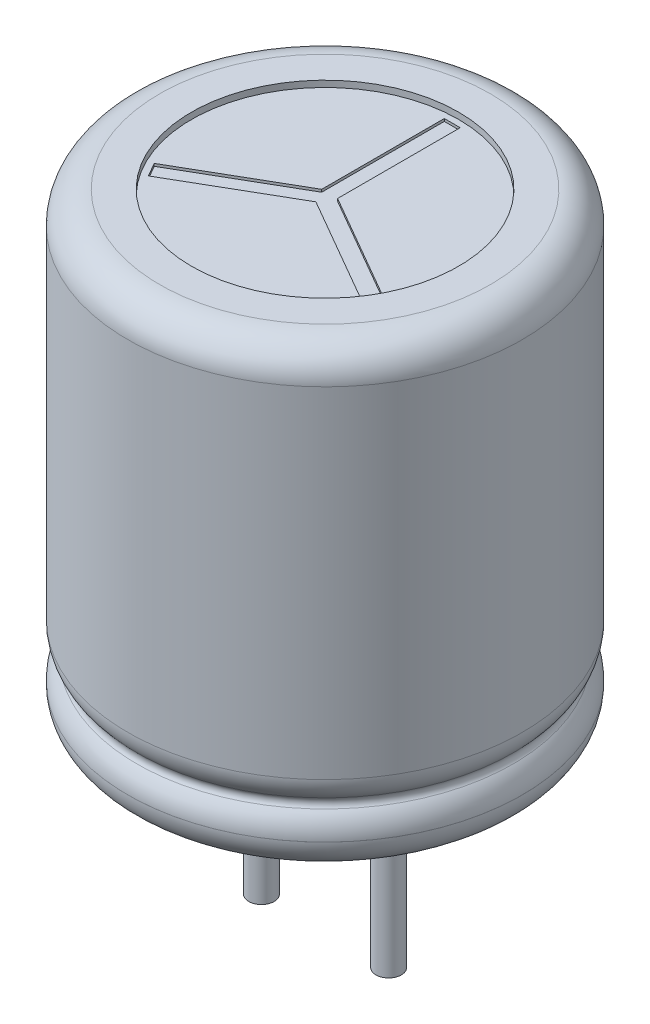
ISO-10303-21;
HEADER;
FILE_DESCRIPTION(('STEP AP214'),'2;1');
FILE_NAME('part.step','',(''),(''),'','','');
FILE_SCHEMA(('AUTOMOTIVE_DESIGN { 1 0 10303 214 1 1 1 1 }'));
ENDSEC;
DATA;
#1=APPLICATION_CONTEXT('core data for automotive mechanical design processes');
#2=APPLICATION_PROTOCOL_DEFINITION('international standard','automotive_design',2000,#1);
#3=PRODUCT_CONTEXT('',#1,'mechanical');
#4=PRODUCT('Part','Part','',(#3));
#5=PRODUCT_RELATED_PRODUCT_CATEGORY('part','',(#4));
#6=PRODUCT_DEFINITION_FORMATION('','',#4);
#7=PRODUCT_DEFINITION_CONTEXT('part definition',#1,'design');
#8=PRODUCT_DEFINITION('design','',#6,#7);
#9=PRODUCT_DEFINITION_SHAPE('','',#8);
#10=(LENGTH_UNIT() NAMED_UNIT(*) SI_UNIT(.MILLI.,.METRE.));
#11=(NAMED_UNIT(*) PLANE_ANGLE_UNIT() SI_UNIT($,.RADIAN.));
#12=(NAMED_UNIT(*) SI_UNIT($,.STERADIAN.) SOLID_ANGLE_UNIT());
#13=UNCERTAINTY_MEASURE_WITH_UNIT(LENGTH_MEASURE(1.E-05),#10,'distance_accuracy_value','');
#14=(GEOMETRIC_REPRESENTATION_CONTEXT(3) GLOBAL_UNCERTAINTY_ASSIGNED_CONTEXT((#13)) GLOBAL_UNIT_ASSIGNED_CONTEXT((#10,
#11,#12)) REPRESENTATION_CONTEXT('',''));
#15=CARTESIAN_POINT('',(0.,0.,0.));
#16=DIRECTION('',(0.,0.,1.));
#17=DIRECTION('',(1.,0.,0.));
#18=AXIS2_PLACEMENT_3D('',#15,#16,#17);
#19=CARTESIAN_POINT('',(1.,-3.,0.));
#20=DIRECTION('',(0.,1.,0.));
#21=DIRECTION('',(0.,0.,1.));
#22=AXIS2_PLACEMENT_3D('',#19,#20,#21);
#23=CYLINDRICAL_SURFACE('',#22,0.2);
#24=CARTESIAN_POINT('',(1.,-3.,0.));
#25=DIRECTION('',(0.,-1.,0.));
#26=DIRECTION('',(0.,0.,1.));
#27=AXIS2_PLACEMENT_3D('',#24,#25,#26);
#28=CIRCLE('',#27,0.2);
#29=CARTESIAN_POINT('',(1.,-3.,0.2));
#30=VERTEX_POINT('',#29);
#31=EDGE_CURVE('E11',#30,#30,#28,.T.);
#32=ORIENTED_EDGE('',*,*,#31,.F.);
#33=EDGE_LOOP('',(#32));
#34=FACE_BOUND('',#33,.T.);
#35=CARTESIAN_POINT('',(1.,0.,0.));
#36=DIRECTION('',(0.,-1.,0.));
#37=DIRECTION('',(0.,0.,1.));
#38=AXIS2_PLACEMENT_3D('',#35,#36,#37);
#39=CIRCLE('',#38,0.2);
#40=CARTESIAN_POINT('',(1.,0.,0.2));
#41=VERTEX_POINT('',#40);
#42=EDGE_CURVE('E42',#41,#41,#39,.T.);
#43=ORIENTED_EDGE('',*,*,#42,.T.);
#44=EDGE_LOOP('',(#43));
#45=FACE_BOUND('',#44,.T.);
#46=ADVANCED_FACE('F39',(#34,#45),#23,.T.);
#47=CARTESIAN_POINT('',(1.,-3.,0.));
#48=DIRECTION('',(0.,1.,0.));
#49=DIRECTION('',(0.,0.,1.));
#50=AXIS2_PLACEMENT_3D('',#47,#48,#49);
#51=PLANE('',#50);
#52=ORIENTED_EDGE('',*,*,#31,.T.);
#53=EDGE_LOOP('',(#52));
#54=FACE_BOUND('',#53,.T.);
#55=ADVANCED_FACE('F54',(#54),#51,.F.);
#56=CARTESIAN_POINT('',(1.,0.,0.));
#57=DIRECTION('',(0.,1.,0.));
#58=DIRECTION('',(0.,0.,1.));
#59=AXIS2_PLACEMENT_3D('',#56,#57,#58);
#60=PLANE('',#59);
#61=ORIENTED_EDGE('',*,*,#42,.F.);
#62=EDGE_LOOP('',(#61));
#63=FACE_BOUND('',#62,.T.);
#64=ADVANCED_FACE('F52',(#63),#60,.T.);
#65=CLOSED_SHELL('',(#46,#55,#64));
#66=MANIFOLD_SOLID_BREP('B2',#65);
#67=CARTESIAN_POINT('',(-1.,-3.,0.));
#68=DIRECTION('',(0.,1.,0.));
#69=DIRECTION('',(0.,0.,1.));
#70=AXIS2_PLACEMENT_3D('',#67,#68,#69);
#71=CYLINDRICAL_SURFACE('',#70,0.2);
#72=CARTESIAN_POINT('',(-1.,-3.,0.));
#73=DIRECTION('',(0.,-1.,0.));
#74=DIRECTION('',(0.,0.,-1.));
#75=AXIS2_PLACEMENT_3D('',#72,#73,#74);
#76=CIRCLE('',#75,0.2);
#77=CARTESIAN_POINT('',(-1.,-3.,-0.2));
#78=VERTEX_POINT('',#77);
#79=EDGE_CURVE('E38',#78,#78,#76,.T.);
#80=ORIENTED_EDGE('',*,*,#79,.F.);
#81=EDGE_LOOP('',(#80));
#82=FACE_BOUND('',#81,.T.);
#83=CARTESIAN_POINT('',(-1.,0.,0.));
#84=DIRECTION('',(0.,-1.,0.));
#85=DIRECTION('',(0.,0.,-1.));
#86=AXIS2_PLACEMENT_3D('',#83,#84,#85);
#87=CIRCLE('',#86,0.2);
#88=CARTESIAN_POINT('',(-1.,0.,-0.2));
#89=VERTEX_POINT('',#88);
#90=EDGE_CURVE('E90',#89,#89,#87,.T.);
#91=ORIENTED_EDGE('',*,*,#90,.T.);
#92=EDGE_LOOP('',(#91));
#93=FACE_BOUND('',#92,.T.);
#94=ADVANCED_FACE('F87',(#82,#93),#71,.T.);
#95=CARTESIAN_POINT('',(-1.,-3.,0.));
#96=DIRECTION('',(0.,-1.,0.));
#97=DIRECTION('',(0.,0.,-1.));
#98=AXIS2_PLACEMENT_3D('',#95,#96,#97);
#99=PLANE('',#98);
#100=ORIENTED_EDGE('',*,*,#79,.T.);
#101=EDGE_LOOP('',(#100));
#102=FACE_BOUND('',#101,.T.);
#103=ADVANCED_FACE('F102',(#102),#99,.T.);
#104=CARTESIAN_POINT('',(-1.,0.,0.));
#105=DIRECTION('',(0.,-1.,0.));
#106=DIRECTION('',(0.,0.,-1.));
#107=AXIS2_PLACEMENT_3D('',#104,#105,#106);
#108=PLANE('',#107);
#109=ORIENTED_EDGE('',*,*,#90,.F.);
#110=EDGE_LOOP('',(#109));
#111=FACE_BOUND('',#110,.T.);
#112=ADVANCED_FACE('F100',(#111),#108,.F.);
#113=CLOSED_SHELL('',(#94,#103,#112));
#114=MANIFOLD_SOLID_BREP('B6',#113);
#115=CARTESIAN_POINT('',(0.,6.6,0.));
#116=DIRECTION('',(0.,-1.,0.));
#117=DIRECTION('',(0.,0.,-1.));
#118=AXIS2_PLACEMENT_3D('',#115,#116,#117);
#119=TOROIDAL_SURFACE('',#118,2.6,0.400000000000001);
#120=CARTESIAN_POINT('',(0.,7.,0.));
#121=DIRECTION('',(0.,-1.,0.));
#122=DIRECTION('',(0.,0.,-1.));
#123=AXIS2_PLACEMENT_3D('',#120,#121,#122);
#124=CIRCLE('',#123,2.6);
#125=CARTESIAN_POINT('',(0.,7.,-2.6));
#126=VERTEX_POINT('',#125);
#127=EDGE_CURVE('E185',#126,#126,#124,.T.);
#128=ORIENTED_EDGE('',*,*,#127,.F.);
#129=EDGE_LOOP('',(#128));
#130=FACE_BOUND('',#129,.T.);
#131=CARTESIAN_POINT('',(0.,6.6,0.));
#132=DIRECTION('',(0.,-1.,0.));
#133=DIRECTION('',(0.,0.,-1.));
#134=AXIS2_PLACEMENT_3D('',#131,#132,#133);
#135=CIRCLE('',#134,3.);
#136=CARTESIAN_POINT('',(0.,6.6,-3.));
#137=VERTEX_POINT('',#136);
#138=EDGE_CURVE('E86',#137,#137,#135,.T.);
#139=ORIENTED_EDGE('',*,*,#138,.T.);
#140=EDGE_LOOP('',(#139));
#141=FACE_BOUND('',#140,.T.);
#142=ADVANCED_FACE('F136',(#130,#141),#119,.F.);
#143=CARTESIAN_POINT('',(0.,0.,0.));
#144=DIRECTION('',(0.,-1.,0.));
#145=DIRECTION('',(0.,0.,-1.));
#146=AXIS2_PLACEMENT_3D('',#143,#144,#145);
#147=CYLINDRICAL_SURFACE('',#146,3.);
#148=ORIENTED_EDGE('',*,*,#138,.F.);
#149=EDGE_LOOP('',(#148));
#150=FACE_BOUND('',#149,.T.);
#151=CARTESIAN_POINT('',(0.,1.25168129847633,0.));
#152=DIRECTION('',(0.,-1.,0.));
#153=DIRECTION('',(0.,0.,-1.));
#154=AXIS2_PLACEMENT_3D('',#151,#152,#153);
#155=CIRCLE('',#154,3.);
#156=CARTESIAN_POINT('',(0.,1.25168129847633,-3.));
#157=VERTEX_POINT('',#156);
#158=EDGE_CURVE('E142',#157,#157,#155,.T.);
#159=ORIENTED_EDGE('',*,*,#158,.T.);
#160=EDGE_LOOP('',(#159));
#161=FACE_BOUND('',#160,.T.);
#162=ADVANCED_FACE('F192',(#150,#161),#147,.F.);
#163=CARTESIAN_POINT('',(0.,0.683149058938359,0.));
#164=DIRECTION('',(0.,1.,0.));
#165=DIRECTION('',(0.,0.,1.));
#166=AXIS2_PLACEMENT_3D('',#163,#164,#165);
#167=CONICAL_SURFACE('',#166,2.88253603384759,0.203742365446496);
#168=ORIENTED_EDGE('',*,*,#158,.F.);
#169=EDGE_LOOP('',(#168));
#170=FACE_BOUND('',#169,.T.);
#171=CARTESIAN_POINT('',(0.,0.683149058938359,0.));
#172=DIRECTION('',(0.,-1.,0.));
#173=DIRECTION('',(0.,0.,-1.));
#174=AXIS2_PLACEMENT_3D('',#171,#172,#173);
#175=CIRCLE('',#174,2.88253603384759);
#176=CARTESIAN_POINT('',(0.,0.683149058938359,-2.88253603384759));
#177=VERTEX_POINT('',#176);
#178=EDGE_CURVE('E146',#177,#177,#175,.T.);
#179=ORIENTED_EDGE('',*,*,#178,.T.);
#180=EDGE_LOOP('',(#179));
#181=FACE_BOUND('',#180,.T.);
#182=ADVANCED_FACE('F196',(#170,#181),#167,.F.);
#183=CARTESIAN_POINT('',(0.,0.400000000000001,0.));
#184=DIRECTION('',(0.,-1.,0.));
#185=DIRECTION('',(0.,0.,-1.));
#186=AXIS2_PLACEMENT_3D('',#183,#184,#185);
#187=TOROIDAL_SURFACE('',#186,2.6,0.400000000000001);
#188=ORIENTED_EDGE('',*,*,#178,.F.);
#189=EDGE_LOOP('',(#188));
#190=FACE_BOUND('',#189,.T.);
#191=CARTESIAN_POINT('',(0.,0.,0.));
#192=DIRECTION('',(0.,-1.,0.));
#193=DIRECTION('',(0.,0.,-1.));
#194=AXIS2_PLACEMENT_3D('',#191,#192,#193);
#195=CIRCLE('',#194,2.6);
#196=CARTESIAN_POINT('',(0.,0.,-2.6));
#197=VERTEX_POINT('',#196);
#198=EDGE_CURVE('E150',#197,#197,#195,.T.);
#199=ORIENTED_EDGE('',*,*,#198,.T.);
#200=EDGE_LOOP('',(#199));
#201=FACE_BOUND('',#200,.T.);
#202=ADVANCED_FACE('F201',(#190,#201),#187,.F.);
#203=CARTESIAN_POINT('',(0.,0.,0.));
#204=DIRECTION('',(0.,-1.,0.));
#205=DIRECTION('',(0.,0.,-1.));
#206=AXIS2_PLACEMENT_3D('',#203,#204,#205);
#207=CYLINDRICAL_SURFACE('',#206,2.6);
#208=ORIENTED_EDGE('',*,*,#198,.F.);
#209=EDGE_LOOP('',(#208));
#210=FACE_BOUND('',#209,.T.);
#211=CARTESIAN_POINT('',(0.,-0.1,0.));
#212=DIRECTION('',(0.,-1.,0.));
#213=DIRECTION('',(0.,0.,-1.));
#214=AXIS2_PLACEMENT_3D('',#211,#212,#213);
#215=CIRCLE('',#214,2.6);
#216=CARTESIAN_POINT('',(0.,-0.1,-2.6));
#217=VERTEX_POINT('',#216);
#218=EDGE_CURVE('E155',#217,#217,#215,.T.);
#219=ORIENTED_EDGE('',*,*,#218,.T.);
#220=EDGE_LOOP('',(#219));
#221=FACE_BOUND('',#220,.T.);
#222=ADVANCED_FACE('F207',(#210,#221),#207,.F.);
#223=CARTESIAN_POINT('',(0.,0.400000000000001,0.));
#224=DIRECTION('',(0.,-1.,0.));
#225=DIRECTION('',(0.,0.,-1.));
#226=AXIS2_PLACEMENT_3D('',#223,#224,#225);
#227=TOROIDAL_SURFACE('',#226,2.6,0.500000000000001);
#228=ORIENTED_EDGE('',*,*,#218,.F.);
#229=EDGE_LOOP('',(#228));
#230=FACE_BOUND('',#229,.T.);
#231=CARTESIAN_POINT('',(0.,0.400000000000001,0.));
#232=DIRECTION('',(0.,-1.,0.));
#233=DIRECTION('',(0.,0.,-1.));
#234=AXIS2_PLACEMENT_3D('',#231,#232,#233);
#235=CIRCLE('',#234,3.1);
#236=CARTESIAN_POINT('',(0.,0.400000000000001,-3.1));
#237=VERTEX_POINT('',#236);
#238=EDGE_CURVE('E158',#237,#237,#235,.T.);
#239=ORIENTED_EDGE('',*,*,#238,.T.);
#240=EDGE_LOOP('',(#239));
#241=FACE_BOUND('',#240,.T.);
#242=ADVANCED_FACE('F211',(#230,#241),#227,.T.);
#243=CARTESIAN_POINT('',(0.,0.,0.));
#244=DIRECTION('',(0.,-1.,0.));
#245=DIRECTION('',(0.,0.,-1.));
#246=AXIS2_PLACEMENT_3D('',#243,#244,#245);
#247=CYLINDRICAL_SURFACE('',#246,3.1);
#248=ORIENTED_EDGE('',*,*,#238,.F.);
#249=EDGE_LOOP('',(#248));
#250=FACE_BOUND('',#249,.T.);
#251=CARTESIAN_POINT('',(0.,0.400804335279112,0.));
#252=DIRECTION('',(0.,-1.,0.));
#253=DIRECTION('',(0.,0.,-1.));
#254=AXIS2_PLACEMENT_3D('',#251,#252,#253);
#255=CIRCLE('',#254,3.1);
#256=CARTESIAN_POINT('',(0.,0.400804335279112,-3.1));
#257=VERTEX_POINT('',#256);
#258=EDGE_CURVE('E161',#257,#257,#255,.T.);
#259=ORIENTED_EDGE('',*,*,#258,.T.);
#260=EDGE_LOOP('',(#259));
#261=FACE_BOUND('',#260,.T.);
#262=ADVANCED_FACE('F215',(#250,#261),#247,.T.);
#263=CARTESIAN_POINT('',(0.,0.400804335279112,0.));
#264=DIRECTION('',(0.,-1.,0.));
#265=DIRECTION('',(0.,0.,-1.));
#266=AXIS2_PLACEMENT_3D('',#263,#264,#265);
#267=TOROIDAL_SURFACE('',#266,2.6,0.5);
#268=ORIENTED_EDGE('',*,*,#258,.F.);
#269=EDGE_LOOP('',(#268));
#270=FACE_BOUND('',#269,.T.);
#271=CARTESIAN_POINT('',(0.,0.750713489270416,0.));
#272=DIRECTION('',(0.,-1.,0.));
#273=DIRECTION('',(0.,0.,-1.));
#274=AXIS2_PLACEMENT_3D('',#271,#272,#273);
#275=CIRCLE('',#274,2.95716044567266);
#276=CARTESIAN_POINT('',(0.,0.750713489270416,-2.95716044567266));
#277=VERTEX_POINT('',#276);
#278=EDGE_CURVE('E164',#277,#277,#275,.T.);
#279=ORIENTED_EDGE('',*,*,#278,.T.);
#280=EDGE_LOOP('',(#279));
#281=FACE_BOUND('',#280,.T.);
#282=ADVANCED_FACE('F219',(#270,#281),#267,.T.);
#283=CARTESIAN_POINT('',(0.,0.826242816877722,0.));
#284=DIRECTION('',(0.,-1.,0.));
#285=DIRECTION('',(0.,0.,-1.));
#286=AXIS2_PLACEMENT_3D('',#283,#284,#285);
#287=TOROIDAL_SURFACE('',#286,3.03425499436301,0.107927052987564);
#288=ORIENTED_EDGE('',*,*,#278,.F.);
#289=EDGE_LOOP('',(#288));
#290=FACE_BOUND('',#289,.T.);
#291=CARTESIAN_POINT('',(0.,0.901772144485029,0.));
#292=DIRECTION('',(0.,-1.,0.));
#293=DIRECTION('',(0.,0.,-1.));
#294=AXIS2_PLACEMENT_3D('',#291,#292,#293);
#295=CIRCLE('',#294,2.95716044567266);
#296=CARTESIAN_POINT('',(0.,0.901772144485029,-2.95716044567266));
#297=VERTEX_POINT('',#296);
#298=EDGE_CURVE('E167',#297,#297,#295,.T.);
#299=ORIENTED_EDGE('',*,*,#298,.T.);
#300=EDGE_LOOP('',(#299));
#301=FACE_BOUND('',#300,.T.);
#302=ADVANCED_FACE('F223',(#290,#301),#287,.F.);
#303=CARTESIAN_POINT('',(0.,1.25168129847633,0.));
#304=DIRECTION('',(0.,-1.,0.));
#305=DIRECTION('',(0.,0.,-1.));
#306=AXIS2_PLACEMENT_3D('',#303,#304,#305);
#307=TOROIDAL_SURFACE('',#306,2.6,0.5);
#308=ORIENTED_EDGE('',*,*,#298,.F.);
#309=EDGE_LOOP('',(#308));
#310=FACE_BOUND('',#309,.T.);
#311=CARTESIAN_POINT('',(0.,1.25168129847633,0.));
#312=DIRECTION('',(0.,-1.,0.));
#313=DIRECTION('',(0.,0.,-1.));
#314=AXIS2_PLACEMENT_3D('',#311,#312,#313);
#315=CIRCLE('',#314,3.1);
#316=CARTESIAN_POINT('',(0.,1.25168129847633,-3.1));
#317=VERTEX_POINT('',#316);
#318=EDGE_CURVE('E170',#317,#317,#315,.T.);
#319=ORIENTED_EDGE('',*,*,#318,.T.);
#320=EDGE_LOOP('',(#319));
#321=FACE_BOUND('',#320,.T.);
#322=ADVANCED_FACE('F227',(#310,#321),#307,.T.);
#323=CARTESIAN_POINT('',(0.,0.,0.));
#324=DIRECTION('',(0.,-1.,0.));
#325=DIRECTION('',(0.,0.,-1.));
#326=AXIS2_PLACEMENT_3D('',#323,#324,#325);
#327=CYLINDRICAL_SURFACE('',#326,3.1);
#328=ORIENTED_EDGE('',*,*,#318,.F.);
#329=EDGE_LOOP('',(#328));
#330=FACE_BOUND('',#329,.T.);
#331=CARTESIAN_POINT('',(0.,6.6,0.));
#332=DIRECTION('',(0.,-1.,0.));
#333=DIRECTION('',(0.,0.,-1.));
#334=AXIS2_PLACEMENT_3D('',#331,#332,#333);
#335=CIRCLE('',#334,3.1);
#336=CARTESIAN_POINT('',(0.,6.6,-3.1));
#337=VERTEX_POINT('',#336);
#338=EDGE_CURVE('E173',#337,#337,#335,.T.);
#339=ORIENTED_EDGE('',*,*,#338,.T.);
#340=EDGE_LOOP('',(#339));
#341=FACE_BOUND('',#340,.T.);
#342=ADVANCED_FACE('F231',(#330,#341),#327,.T.);
#343=CARTESIAN_POINT('',(0.,6.6,0.));
#344=DIRECTION('',(0.,-1.,0.));
#345=DIRECTION('',(0.,0.,-1.));
#346=AXIS2_PLACEMENT_3D('',#343,#344,#345);
#347=TOROIDAL_SURFACE('',#346,2.6,0.500000000000001);
#348=ORIENTED_EDGE('',*,*,#338,.F.);
#349=EDGE_LOOP('',(#348));
#350=FACE_BOUND('',#349,.T.);
#351=CARTESIAN_POINT('',(0.,7.1,0.));
#352=DIRECTION('',(0.,-1.,0.));
#353=DIRECTION('',(0.,0.,-1.));
#354=AXIS2_PLACEMENT_3D('',#351,#352,#353);
#355=CIRCLE('',#354,2.6);
#356=CARTESIAN_POINT('',(0.,7.1,-2.6));
#357=VERTEX_POINT('',#356);
#358=EDGE_CURVE('E176',#357,#357,#355,.T.);
#359=ORIENTED_EDGE('',*,*,#358,.T.);
#360=EDGE_LOOP('',(#359));
#361=FACE_BOUND('',#360,.T.);
#362=ADVANCED_FACE('F235',(#350,#361),#347,.T.);
#363=CARTESIAN_POINT('',(-2.6,7.1,0.));
#364=DIRECTION('',(0.,-1.,0.));
#365=DIRECTION('',(0.,0.,-1.));
#366=AXIS2_PLACEMENT_3D('',#363,#364,#365);
#367=PLANE('',#366);
#368=ORIENTED_EDGE('',*,*,#358,.F.);
#369=EDGE_LOOP('',(#368));
#370=FACE_BOUND('',#369,.T.);
#371=CARTESIAN_POINT('',(0.,7.1,0.));
#372=DIRECTION('',(0.,-1.,0.));
#373=DIRECTION('',(0.,0.,-1.));
#374=AXIS2_PLACEMENT_3D('',#371,#372,#373);
#375=CIRCLE('',#374,2.1);
#376=CARTESIAN_POINT('',(0.,7.1,-2.1));
#377=VERTEX_POINT('',#376);
#378=EDGE_CURVE('E179',#377,#377,#375,.T.);
#379=ORIENTED_EDGE('',*,*,#378,.T.);
#380=EDGE_LOOP('',(#379));
#381=FACE_BOUND('',#380,.T.);
#382=ADVANCED_FACE('F239',(#370,#381),#367,.F.);
#383=CARTESIAN_POINT('',(0.,0.,0.));
#384=DIRECTION('',(0.,-1.,0.));
#385=DIRECTION('',(0.,0.,-1.));
#386=AXIS2_PLACEMENT_3D('',#383,#384,#385);
#387=CYLINDRICAL_SURFACE('',#386,2.1);
#388=ORIENTED_EDGE('',*,*,#378,.F.);
#389=EDGE_LOOP('',(#388));
#390=FACE_BOUND('',#389,.T.);
#391=CARTESIAN_POINT('',(0.,7.,0.));
#392=DIRECTION('',(0.,-1.,0.));
#393=DIRECTION('',(0.,0.,-1.));
#394=AXIS2_PLACEMENT_3D('',#391,#392,#393);
#395=CIRCLE('',#394,2.1);
#396=CARTESIAN_POINT('',(0.,7.,-2.1));
#397=VERTEX_POINT('',#396);
#398=EDGE_CURVE('E182',#397,#397,#395,.T.);
#399=ORIENTED_EDGE('',*,*,#398,.T.);
#400=EDGE_LOOP('',(#399));
#401=FACE_BOUND('',#400,.T.);
#402=ADVANCED_FACE('F243',(#390,#401),#387,.F.);
#403=CARTESIAN_POINT('',(-2.1,7.,0.));
#404=DIRECTION('',(0.,1.,0.));
#405=DIRECTION('',(0.,0.,1.));
#406=AXIS2_PLACEMENT_3D('',#403,#404,#405);
#407=PLANE('',#406);
#408=ORIENTED_EDGE('',*,*,#398,.F.);
#409=EDGE_LOOP('',(#408));
#410=FACE_BOUND('',#409,.T.);
#411=ORIENTED_EDGE('',*,*,#127,.T.);
#412=EDGE_LOOP('',(#411));
#413=FACE_BOUND('',#412,.T.);
#414=ADVANCED_FACE('F189',(#410,#413),#407,.F.);
#415=CLOSED_SHELL('',(#142,#162,#182,#202,#222,#242,#262,#282,#302,#322,#342,#362,#382,#402,#414));
#416=MANIFOLD_SOLID_BREP('B33',#415);
#417=CARTESIAN_POINT('',(0.,0.,0.));
#418=DIRECTION('',(0.,-1.,0.));
#419=DIRECTION('',(0.,0.,-1.));
#420=AXIS2_PLACEMENT_3D('',#417,#418,#419);
#421=CYLINDRICAL_SURFACE('',#420,3.);
#422=CARTESIAN_POINT('',(0.,0.400000000000001,0.));
#423=DIRECTION('',(0.,-1.,0.));
#424=DIRECTION('',(0.,0.,-1.));
#425=AXIS2_PLACEMENT_3D('',#422,#423,#424);
#426=CIRCLE('',#425,3.);
#427=CARTESIAN_POINT('',(0.,0.400000000000001,-3.));
#428=VERTEX_POINT('',#427);
#429=EDGE_CURVE('E508',#428,#428,#426,.T.);
#430=ORIENTED_EDGE('',*,*,#429,.F.);
#431=EDGE_LOOP('',(#430));
#432=FACE_BOUND('',#431,.T.);
#433=CARTESIAN_POINT('',(0.,0.606567662780015,0.));
#434=DIRECTION('',(0.,1.,0.));
#435=DIRECTION('',(0.,0.,1.));
#436=AXIS2_PLACEMENT_3D('',#433,#434,#435);
#437=CIRCLE('',#436,3.);
#438=CARTESIAN_POINT('',(0.,0.606567662780015,3.));
#439=VERTEX_POINT('',#438);
#440=EDGE_CURVE('E366',#439,#439,#437,.T.);
#441=ORIENTED_EDGE('',*,*,#440,.F.);
#442=EDGE_LOOP('',(#441));
#443=FACE_BOUND('',#442,.T.);
#444=ADVANCED_FACE('F362',(#432,#443),#421,.T.);
#445=CARTESIAN_POINT('',(0.,0.400000000000001,0.));
#446=DIRECTION('',(0.,-1.,0.));
#447=DIRECTION('',(0.,0.,-1.));
#448=AXIS2_PLACEMENT_3D('',#445,#446,#447);
#449=TOROIDAL_SURFACE('',#448,2.6,0.400000000000001);
#450=CARTESIAN_POINT('',(0.,0.,0.));
#451=DIRECTION('',(0.,-1.,0.));
#452=DIRECTION('',(0.,0.,-1.));
#453=AXIS2_PLACEMENT_3D('',#450,#451,#452);
#454=CIRCLE('',#453,2.6);
#455=CARTESIAN_POINT('',(0.,0.,-2.6));
#456=VERTEX_POINT('',#455);
#457=EDGE_CURVE('E505',#456,#456,#454,.T.);
#458=ORIENTED_EDGE('',*,*,#457,.F.);
#459=EDGE_LOOP('',(#458));
#460=FACE_BOUND('',#459,.T.);
#461=ORIENTED_EDGE('',*,*,#429,.T.);
#462=EDGE_LOOP('',(#461));
#463=FACE_BOUND('',#462,.T.);
#464=ADVANCED_FACE('F521',(#460,#463),#449,.T.);
#465=CARTESIAN_POINT('',(-2.6,0.,0.));
#466=DIRECTION('',(0.,1.,0.));
#467=DIRECTION('',(0.,0.,1.));
#468=AXIS2_PLACEMENT_3D('',#465,#466,#467);
#469=PLANE('',#468);
#470=ORIENTED_EDGE('',*,*,#457,.T.);
#471=EDGE_LOOP('',(#470));
#472=FACE_BOUND('',#471,.T.);
#473=ADVANCED_FACE('F528',(#472),#469,.F.);
#474=CARTESIAN_POINT('',(0.,0.906567662780018,0.));
#475=DIRECTION('',(0.,-1.,0.));
#476=DIRECTION('',(0.,0.,-1.));
#477=AXIS2_PLACEMENT_3D('',#474,#475,#476);
#478=TOROIDAL_SURFACE('',#477,3.4,0.5);
#479=CARTESIAN_POINT('',(0.,1.20656766278002,0.));
#480=DIRECTION('',(0.,-1.,0.));
#481=DIRECTION('',(0.,0.,-1.));
#482=AXIS2_PLACEMENT_3D('',#479,#480,#481);
#483=CIRCLE('',#482,3.);
#484=CARTESIAN_POINT('',(0.,1.20656766278002,-3.));
#485=VERTEX_POINT('',#484);
#486=EDGE_CURVE('E493',#485,#485,#483,.T.);
#487=ORIENTED_EDGE('',*,*,#486,.T.);
#488=EDGE_LOOP('',(#487));
#489=FACE_BOUND('',#488,.T.);
#490=ORIENTED_EDGE('',*,*,#440,.T.);
#491=EDGE_LOOP('',(#490));
#492=FACE_BOUND('',#491,.T.);
#493=ADVANCED_FACE('F518',(#489,#492),#478,.F.);
#494=CARTESIAN_POINT('',(0.,7.,0.));
#495=DIRECTION('',(0.,-1.,0.));
#496=DIRECTION('',(0.,0.,-1.));
#497=AXIS2_PLACEMENT_3D('',#494,#495,#496);
#498=PLANE('',#497);
#499=DIRECTION('',(0.500000000000001,0.,0.866025403784438));
#500=VECTOR('',#499,1.);
#501=CARTESIAN_POINT('',(-1.79455080756888,7.,0.891746824526948));
#502=LINE('',#501,#500);
#503=CARTESIAN_POINT('',(-1.79455080756888,7.,0.891746824526948));
#504=VERTEX_POINT('',#503);
#505=CARTESIAN_POINT('',(-1.66955080756888,7.,1.10825317547306));
#506=VERTEX_POINT('',#505);
#507=EDGE_CURVE('E471',#504,#506,#502,.T.);
#508=ORIENTED_EDGE('',*,*,#507,.F.);
#509=DIRECTION('',(-0.866025403784438,0.,0.500000000000002));
#510=VECTOR('',#509,1.);
#511=CARTESIAN_POINT('',(-0.125,7.,-0.0721687836487036));
#512=LINE('',#511,#510);
#513=CARTESIAN_POINT('',(-0.125,7.,-0.0721687836487036));
#514=VERTEX_POINT('',#513);
#515=EDGE_CURVE('E379',#514,#504,#512,.T.);
#516=ORIENTED_EDGE('',*,*,#515,.F.);
#517=DIRECTION('',(0.,0.,1.));
#518=VECTOR('',#517,1.);
#519=CARTESIAN_POINT('',(-0.124999999999999,7.,-2.));
#520=LINE('',#519,#518);
#521=CARTESIAN_POINT('',(-0.124999999999999,7.,-2.));
#522=VERTEX_POINT('',#521);
#523=EDGE_CURVE('E489',#522,#514,#520,.T.);
#524=ORIENTED_EDGE('',*,*,#523,.F.);
#525=DIRECTION('',(-1.,0.,0.));
#526=VECTOR('',#525,1.);
#527=CARTESIAN_POINT('',(0.125000000000001,7.,-2.));
#528=LINE('',#527,#526);
#529=CARTESIAN_POINT('',(0.125000000000001,7.,-2.));
#530=VERTEX_POINT('',#529);
#531=EDGE_CURVE('E487',#530,#522,#528,.T.);
#532=ORIENTED_EDGE('',*,*,#531,.F.);
#533=DIRECTION('',(0.,0.,-1.));
#534=VECTOR('',#533,1.);
#535=CARTESIAN_POINT('',(0.125,7.,-0.0721687836487036));
#536=LINE('',#535,#534);
#537=CARTESIAN_POINT('',(0.125,7.,-0.0721687836487036));
#538=VERTEX_POINT('',#537);
#539=EDGE_CURVE('E445',#538,#530,#536,.T.);
#540=ORIENTED_EDGE('',*,*,#539,.F.);
#541=DIRECTION('',(-0.866025403784438,0.,-0.5));
#542=VECTOR('',#541,1.);
#543=CARTESIAN_POINT('',(1.79455080756888,7.,0.891746824526945));
#544=LINE('',#543,#542);
#545=CARTESIAN_POINT('',(1.79455080756888,7.,0.891746824526945));
#546=VERTEX_POINT('',#545);
#547=EDGE_CURVE('E483',#546,#538,#544,.T.);
#548=ORIENTED_EDGE('',*,*,#547,.F.);
#549=DIRECTION('',(0.500000000000001,0.,-0.866025403784438));
#550=VECTOR('',#549,1.);
#551=CARTESIAN_POINT('',(1.66955080756888,7.,1.10825317547305));
#552=LINE('',#551,#550);
#553=CARTESIAN_POINT('',(1.66955080756888,7.,1.10825317547305));
#554=VERTEX_POINT('',#553);
#555=EDGE_CURVE('E480',#554,#546,#552,.T.);
#556=ORIENTED_EDGE('',*,*,#555,.F.);
#557=DIRECTION('',(0.866025403784438,0.,0.5));
#558=VECTOR('',#557,1.);
#559=CARTESIAN_POINT('',(0.,7.,0.144337567297406));
#560=LINE('',#559,#558);
#561=CARTESIAN_POINT('',(0.,7.,0.144337567297406));
#562=VERTEX_POINT('',#561);
#563=EDGE_CURVE('E477',#562,#554,#560,.T.);
#564=ORIENTED_EDGE('',*,*,#563,.F.);
#565=DIRECTION('',(0.866025403784438,0.,-0.500000000000002));
#566=VECTOR('',#565,1.);
#567=CARTESIAN_POINT('',(-1.66955080756888,7.,1.10825317547306));
#568=LINE('',#567,#566);
#569=EDGE_CURVE('E474',#506,#562,#568,.T.);
#570=ORIENTED_EDGE('',*,*,#569,.F.);
#571=EDGE_LOOP('',(#508,#516,#524,#532,#540,#548,#556,#564,#570));
#572=FACE_BOUND('',#571,.T.);
#573=CARTESIAN_POINT('',(0.,7.,0.));
#574=DIRECTION('',(0.,-1.,0.));
#575=DIRECTION('',(0.,0.,-1.));
#576=AXIS2_PLACEMENT_3D('',#573,#574,#575);
#577=CIRCLE('',#576,2.6);
#578=CARTESIAN_POINT('',(0.,7.,-2.6));
#579=VERTEX_POINT('',#578);
#580=EDGE_CURVE('E134',#579,#579,#577,.T.);
#581=ORIENTED_EDGE('',*,*,#580,.F.);
#582=EDGE_LOOP('',(#581));
#583=FACE_BOUND('',#582,.T.);
#584=ADVANCED_FACE('F364',(#572,#583),#498,.F.);
#585=CARTESIAN_POINT('',(0.,6.6,0.));
#586=DIRECTION('',(0.,-1.,0.));
#587=DIRECTION('',(0.,0.,-1.));
#588=AXIS2_PLACEMENT_3D('',#585,#586,#587);
#589=TOROIDAL_SURFACE('',#588,2.6,0.400000000000001);
#590=CARTESIAN_POINT('',(0.,6.6,0.));
#591=DIRECTION('',(0.,-1.,0.));
#592=DIRECTION('',(0.,0.,-1.));
#593=AXIS2_PLACEMENT_3D('',#590,#591,#592);
#594=CIRCLE('',#593,3.);
#595=CARTESIAN_POINT('',(0.,6.6,-3.));
#596=VERTEX_POINT('',#595);
#597=EDGE_CURVE('E371',#596,#596,#594,.T.);
#598=ORIENTED_EDGE('',*,*,#597,.F.);
#599=EDGE_LOOP('',(#598));
#600=FACE_BOUND('',#599,.T.);
#601=ORIENTED_EDGE('',*,*,#580,.T.);
#602=EDGE_LOOP('',(#601));
#603=FACE_BOUND('',#602,.T.);
#604=ADVANCED_FACE('F534',(#600,#603),#589,.T.);
#605=ORIENTED_EDGE('',*,*,#597,.T.);
#606=EDGE_LOOP('',(#605));
#607=FACE_BOUND('',#606,.T.);
#608=ORIENTED_EDGE('',*,*,#486,.F.);
#609=EDGE_LOOP('',(#608));
#610=FACE_BOUND('',#609,.T.);
#611=ADVANCED_FACE('F524',(#607,#610),#421,.T.);
#612=CARTESIAN_POINT('',(-0.125,6.96,-0.0721687836487036));
#613=DIRECTION('',(-0.500000000000002,0.,-0.866025403784438));
#614=DIRECTION('',(-0.866025403784438,0.,0.500000000000002));
#615=AXIS2_PLACEMENT_3D('',#612,#613,#614);
#616=PLANE('',#615);
#617=ORIENTED_EDGE('',*,*,#515,.T.);
#618=DIRECTION('',(0.,1.,0.));
#619=VECTOR('',#618,1.);
#620=CARTESIAN_POINT('',(-1.79455080756888,6.96,0.891746824526948));
#621=LINE('',#620,#619);
#622=CARTESIAN_POINT('',(-1.79455080756888,6.96,0.891746824526948));
#623=VERTEX_POINT('',#622);
#624=EDGE_CURVE('E418',#623,#504,#621,.T.);
#625=ORIENTED_EDGE('',*,*,#624,.F.);
#626=DIRECTION('',(-0.866025403784438,0.,0.500000000000002));
#627=VECTOR('',#626,1.);
#628=CARTESIAN_POINT('',(-0.125,6.96,-0.0721687836487036));
#629=LINE('',#628,#627);
#630=CARTESIAN_POINT('',(-0.125,6.96,-0.0721687836487036));
#631=VERTEX_POINT('',#630);
#632=EDGE_CURVE('E491',#631,#623,#629,.T.);
#633=ORIENTED_EDGE('',*,*,#632,.F.);
#634=DIRECTION('',(0.,1.,0.));
#635=VECTOR('',#634,1.);
#636=CARTESIAN_POINT('',(-0.125,6.96,-0.0721687836487036));
#637=LINE('',#636,#635);
#638=EDGE_CURVE('E387',#631,#514,#637,.T.);
#639=ORIENTED_EDGE('',*,*,#638,.T.);
#640=EDGE_LOOP('',(#617,#625,#633,#639));
#641=FACE_BOUND('',#640,.T.);
#642=ADVANCED_FACE('F533',(#641),#616,.F.);
#643=CARTESIAN_POINT('',(-0.124999999999999,6.96,-2.));
#644=DIRECTION('',(-1.,0.,0.));
#645=DIRECTION('',(0.,0.,1.));
#646=AXIS2_PLACEMENT_3D('',#643,#644,#645);
#647=PLANE('',#646);
#648=ORIENTED_EDGE('',*,*,#523,.T.);
#649=ORIENTED_EDGE('',*,*,#638,.F.);
#650=DIRECTION('',(0.,0.,1.));
#651=VECTOR('',#650,1.);
#652=CARTESIAN_POINT('',(-0.124999999999999,6.96,-2.));
#653=LINE('',#652,#651);
#654=CARTESIAN_POINT('',(-0.124999999999999,6.96,-2.));
#655=VERTEX_POINT('',#654);
#656=EDGE_CURVE('E457',#655,#631,#653,.T.);
#657=ORIENTED_EDGE('',*,*,#656,.F.);
#658=DIRECTION('',(0.,1.,0.));
#659=VECTOR('',#658,1.);
#660=CARTESIAN_POINT('',(-0.124999999999999,6.96,-2.));
#661=LINE('',#660,#659);
#662=EDGE_CURVE('E449',#655,#522,#661,.T.);
#663=ORIENTED_EDGE('',*,*,#662,.T.);
#664=EDGE_LOOP('',(#648,#649,#657,#663));
#665=FACE_BOUND('',#664,.T.);
#666=ADVANCED_FACE('F540',(#665),#647,.F.);
#667=CARTESIAN_POINT('',(0.125000000000001,6.96,-2.));
#668=DIRECTION('',(0.,0.,-1.));
#669=DIRECTION('',(-1.,0.,0.));
#670=AXIS2_PLACEMENT_3D('',#667,#668,#669);
#671=PLANE('',#670);
#672=ORIENTED_EDGE('',*,*,#531,.T.);
#673=ORIENTED_EDGE('',*,*,#662,.F.);
#674=DIRECTION('',(-1.,0.,0.));
#675=VECTOR('',#674,1.);
#676=CARTESIAN_POINT('',(0.125000000000001,6.96,-2.));
#677=LINE('',#676,#675);
#678=CARTESIAN_POINT('',(0.125000000000001,6.96,-2.));
#679=VERTEX_POINT('',#678);
#680=EDGE_CURVE('E453',#679,#655,#677,.T.);
#681=ORIENTED_EDGE('',*,*,#680,.F.);
#682=DIRECTION('',(0.,1.,0.));
#683=VECTOR('',#682,1.);
#684=CARTESIAN_POINT('',(0.125000000000001,6.96,-2.));
#685=LINE('',#684,#683);
#686=EDGE_CURVE('E438',#679,#530,#685,.T.);
#687=ORIENTED_EDGE('',*,*,#686,.T.);
#688=EDGE_LOOP('',(#672,#673,#681,#687));
#689=FACE_BOUND('',#688,.T.);
#690=ADVANCED_FACE('F454',(#689),#671,.F.);
#691=CARTESIAN_POINT('',(0.125,6.96,-0.0721687836487036));
#692=DIRECTION('',(1.,0.,0.));
#693=DIRECTION('',(0.,0.,-1.));
#694=AXIS2_PLACEMENT_3D('',#691,#692,#693);
#695=PLANE('',#694);
#696=ORIENTED_EDGE('',*,*,#539,.T.);
#697=ORIENTED_EDGE('',*,*,#686,.F.);
#698=DIRECTION('',(0.,0.,-1.));
#699=VECTOR('',#698,1.);
#700=CARTESIAN_POINT('',(0.125,6.96,-0.0721687836487036));
#701=LINE('',#700,#699);
#702=CARTESIAN_POINT('',(0.125,6.96,-0.0721687836487036));
#703=VERTEX_POINT('',#702);
#704=EDGE_CURVE('E442',#703,#679,#701,.T.);
#705=ORIENTED_EDGE('',*,*,#704,.F.);
#706=DIRECTION('',(0.,1.,0.));
#707=VECTOR('',#706,1.);
#708=CARTESIAN_POINT('',(0.125,6.96,-0.0721687836487036));
#709=LINE('',#708,#707);
#710=EDGE_CURVE('E450',#703,#538,#709,.T.);
#711=ORIENTED_EDGE('',*,*,#710,.T.);
#712=EDGE_LOOP('',(#696,#697,#705,#711));
#713=FACE_BOUND('',#712,.T.);
#714=ADVANCED_FACE('F440',(#713),#695,.F.);
#715=CARTESIAN_POINT('',(1.79455080756888,6.96,0.891746824526945));
#716=DIRECTION('',(0.5,0.,-0.866025403784438));
#717=DIRECTION('',(-0.866025403784439,0.,-0.5));
#718=AXIS2_PLACEMENT_3D('',#715,#716,#717);
#719=PLANE('',#718);
#720=ORIENTED_EDGE('',*,*,#547,.T.);
#721=ORIENTED_EDGE('',*,*,#710,.F.);
#722=DIRECTION('',(-0.866025403784438,0.,-0.5));
#723=VECTOR('',#722,1.);
#724=CARTESIAN_POINT('',(1.79455080756888,6.96,0.891746824526945));
#725=LINE('',#724,#723);
#726=CARTESIAN_POINT('',(1.79455080756888,6.96,0.891746824526945));
#727=VERTEX_POINT('',#726);
#728=EDGE_CURVE('E463',#727,#703,#725,.T.);
#729=ORIENTED_EDGE('',*,*,#728,.F.);
#730=DIRECTION('',(0.,1.,0.));
#731=VECTOR('',#730,1.);
#732=CARTESIAN_POINT('',(1.79455080756888,6.96,0.891746824526945));
#733=LINE('',#732,#731);
#734=EDGE_CURVE('E496',#727,#546,#733,.T.);
#735=ORIENTED_EDGE('',*,*,#734,.T.);
#736=EDGE_LOOP('',(#720,#721,#729,#735));
#737=FACE_BOUND('',#736,.T.);
#738=ADVANCED_FACE('F578',(#737),#719,.F.);
#739=CARTESIAN_POINT('',(1.66955080756888,6.96,1.10825317547305));
#740=DIRECTION('',(0.866025403784438,0.,0.500000000000001));
#741=DIRECTION('',(0.500000000000001,0.,-0.866025403784438));
#742=AXIS2_PLACEMENT_3D('',#739,#740,#741);
#743=PLANE('',#742);
#744=ORIENTED_EDGE('',*,*,#555,.T.);
#745=ORIENTED_EDGE('',*,*,#734,.F.);
#746=DIRECTION('',(0.500000000000001,0.,-0.866025403784438));
#747=VECTOR('',#746,1.);
#748=CARTESIAN_POINT('',(1.66955080756888,6.96,1.10825317547305));
#749=LINE('',#748,#747);
#750=CARTESIAN_POINT('',(1.66955080756888,6.96,1.10825317547305));
#751=VERTEX_POINT('',#750);
#752=EDGE_CURVE('E465',#751,#727,#749,.T.);
#753=ORIENTED_EDGE('',*,*,#752,.F.);
#754=DIRECTION('',(0.,1.,0.));
#755=VECTOR('',#754,1.);
#756=CARTESIAN_POINT('',(1.66955080756888,6.96,1.10825317547305));
#757=LINE('',#756,#755);
#758=EDGE_CURVE('E498',#751,#554,#757,.T.);
#759=ORIENTED_EDGE('',*,*,#758,.T.);
#760=EDGE_LOOP('',(#744,#745,#753,#759));
#761=FACE_BOUND('',#760,.T.);
#762=ADVANCED_FACE('F574',(#761),#743,.F.);
#763=CARTESIAN_POINT('',(0.,6.96,0.144337567297406));
#764=DIRECTION('',(-0.5,0.,0.866025403784438));
#765=DIRECTION('',(0.866025403784439,0.,0.5));
#766=AXIS2_PLACEMENT_3D('',#763,#764,#765);
#767=PLANE('',#766);
#768=ORIENTED_EDGE('',*,*,#563,.T.);
#769=ORIENTED_EDGE('',*,*,#758,.F.);
#770=DIRECTION('',(0.866025403784438,0.,0.5));
#771=VECTOR('',#770,1.);
#772=CARTESIAN_POINT('',(0.,6.96,0.144337567297406));
#773=LINE('',#772,#771);
#774=CARTESIAN_POINT('',(0.,6.96,0.144337567297406));
#775=VERTEX_POINT('',#774);
#776=EDGE_CURVE('E569',#775,#751,#773,.T.);
#777=ORIENTED_EDGE('',*,*,#776,.F.);
#778=DIRECTION('',(0.,1.,0.));
#779=VECTOR('',#778,1.);
#780=CARTESIAN_POINT('',(0.,6.96,0.144337567297406));
#781=LINE('',#780,#779);
#782=EDGE_CURVE('E500',#775,#562,#781,.T.);
#783=ORIENTED_EDGE('',*,*,#782,.T.);
#784=EDGE_LOOP('',(#768,#769,#777,#783));
#785=FACE_BOUND('',#784,.T.);
#786=ADVANCED_FACE('F593',(#785),#767,.F.);
#787=CARTESIAN_POINT('',(-1.66955080756888,6.96,1.10825317547306));
#788=DIRECTION('',(0.500000000000002,0.,0.866025403784438));
#789=DIRECTION('',(0.866025403784438,0.,-0.500000000000002));
#790=AXIS2_PLACEMENT_3D('',#787,#788,#789);
#791=PLANE('',#790);
#792=ORIENTED_EDGE('',*,*,#569,.T.);
#793=ORIENTED_EDGE('',*,*,#782,.F.);
#794=DIRECTION('',(0.866025403784438,0.,-0.500000000000002));
#795=VECTOR('',#794,1.);
#796=CARTESIAN_POINT('',(-1.66955080756888,6.96,1.10825317547306));
#797=LINE('',#796,#795);
#798=CARTESIAN_POINT('',(-1.66955080756888,6.96,1.10825317547306));
#799=VERTEX_POINT('',#798);
#800=EDGE_CURVE('E564',#799,#775,#797,.T.);
#801=ORIENTED_EDGE('',*,*,#800,.F.);
#802=DIRECTION('',(0.,1.,0.));
#803=VECTOR('',#802,1.);
#804=CARTESIAN_POINT('',(-1.66955080756888,6.96,1.10825317547306));
#805=LINE('',#804,#803);
#806=EDGE_CURVE('E502',#799,#506,#805,.T.);
#807=ORIENTED_EDGE('',*,*,#806,.T.);
#808=EDGE_LOOP('',(#792,#793,#801,#807));
#809=FACE_BOUND('',#808,.T.);
#810=ADVANCED_FACE('F596',(#809),#791,.F.);
#811=CARTESIAN_POINT('',(-1.79455080756888,6.96,0.891746824526948));
#812=DIRECTION('',(-0.866025403784438,0.,0.500000000000001));
#813=DIRECTION('',(0.500000000000002,0.,0.866025403784438));
#814=AXIS2_PLACEMENT_3D('',#811,#812,#813);
#815=PLANE('',#814);
#816=ORIENTED_EDGE('',*,*,#507,.T.);
#817=ORIENTED_EDGE('',*,*,#806,.F.);
#818=DIRECTION('',(0.500000000000001,0.,0.866025403784438));
#819=VECTOR('',#818,1.);
#820=CARTESIAN_POINT('',(-1.79455080756888,6.96,0.891746824526948));
#821=LINE('',#820,#819);
#822=EDGE_CURVE('E562',#623,#799,#821,.T.);
#823=ORIENTED_EDGE('',*,*,#822,.F.);
#824=ORIENTED_EDGE('',*,*,#624,.T.);
#825=EDGE_LOOP('',(#816,#817,#823,#824));
#826=FACE_BOUND('',#825,.T.);
#827=ADVANCED_FACE('F559',(#826),#815,.F.);
#828=CARTESIAN_POINT('',(0.,6.96,0.));
#829=DIRECTION('',(0.,1.,0.));
#830=DIRECTION('',(0.,0.,1.));
#831=AXIS2_PLACEMENT_3D('',#828,#829,#830);
#832=PLANE('',#831);
#833=ORIENTED_EDGE('',*,*,#632,.T.);
#834=ORIENTED_EDGE('',*,*,#822,.T.);
#835=ORIENTED_EDGE('',*,*,#800,.T.);
#836=ORIENTED_EDGE('',*,*,#776,.T.);
#837=ORIENTED_EDGE('',*,*,#752,.T.);
#838=ORIENTED_EDGE('',*,*,#728,.T.);
#839=ORIENTED_EDGE('',*,*,#704,.T.);
#840=ORIENTED_EDGE('',*,*,#680,.T.);
#841=ORIENTED_EDGE('',*,*,#656,.T.);
#842=EDGE_LOOP('',(#833,#834,#835,#836,#837,#838,#839,#840,#841));
#843=FACE_BOUND('',#842,.T.);
#844=ADVANCED_FACE('F460',(#843),#832,.T.);
#845=CLOSED_SHELL('',(#444,#464,#473,#493,#584,#604,#611,#642,#666,#690,#714,#738,#762,#786,
#810,#827,#844));
#846=MANIFOLD_SOLID_BREP('B81',#845);
#847=ADVANCED_BREP_SHAPE_REPRESENTATION('',(#18,#66,#114,#416,#846),#14);
#848=SHAPE_DEFINITION_REPRESENTATION(#9,#847);
ENDSEC;
END-ISO-10303-21;
